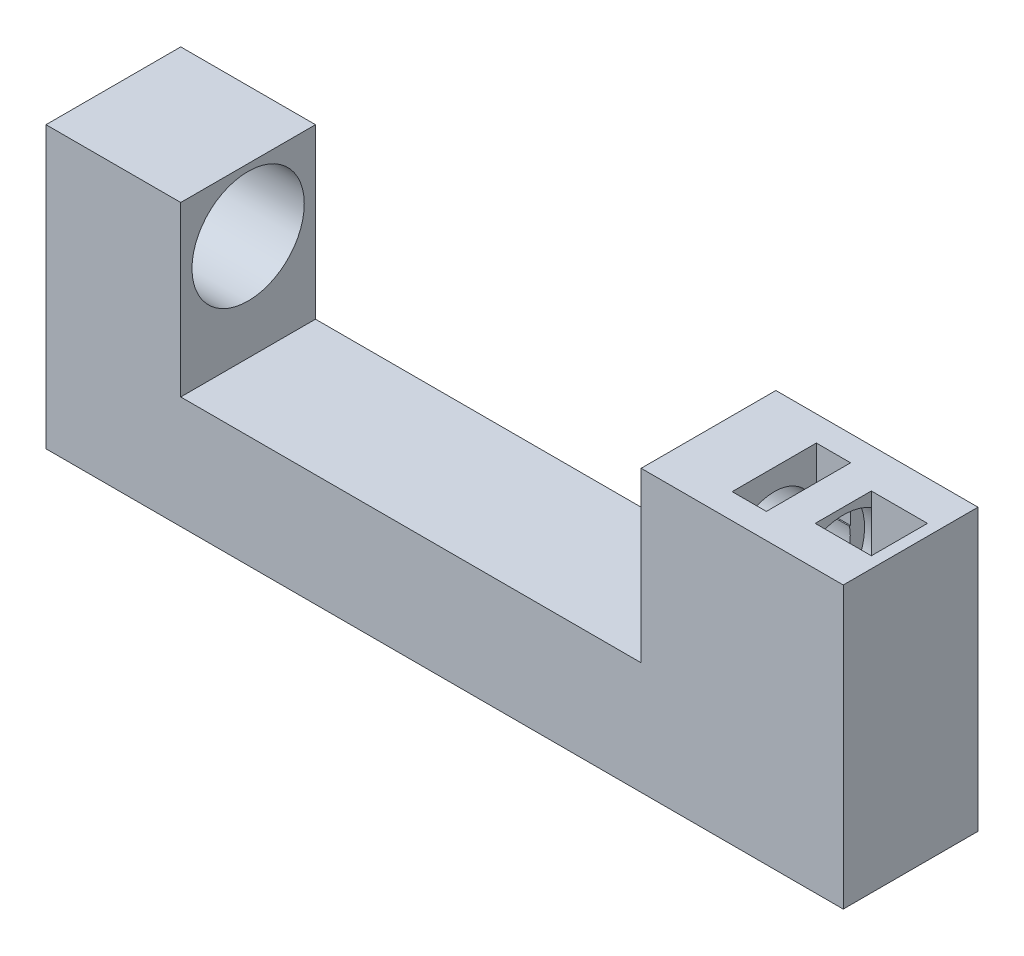
ISO-10303-21;
HEADER;
FILE_DESCRIPTION(('STEP AP214'),'2;1');
FILE_NAME('part.step','',(''),(''),'','','');
FILE_SCHEMA(('AUTOMOTIVE_DESIGN { 1 0 10303 214 1 1 1 1 }'));
ENDSEC;
DATA;
#1=APPLICATION_CONTEXT('core data for automotive mechanical design processes');
#2=APPLICATION_PROTOCOL_DEFINITION('international standard','automotive_design',2000,#1);
#3=PRODUCT_CONTEXT('',#1,'mechanical');
#4=PRODUCT('Part','Part','',(#3));
#5=PRODUCT_RELATED_PRODUCT_CATEGORY('part','',(#4));
#6=PRODUCT_DEFINITION_FORMATION('','',#4);
#7=PRODUCT_DEFINITION_CONTEXT('part definition',#1,'design');
#8=PRODUCT_DEFINITION('design','',#6,#7);
#9=PRODUCT_DEFINITION_SHAPE('','',#8);
#10=(LENGTH_UNIT() NAMED_UNIT(*) SI_UNIT(.MILLI.,.METRE.));
#11=(NAMED_UNIT(*) PLANE_ANGLE_UNIT() SI_UNIT($,.RADIAN.));
#12=(NAMED_UNIT(*) SI_UNIT($,.STERADIAN.) SOLID_ANGLE_UNIT());
#13=UNCERTAINTY_MEASURE_WITH_UNIT(LENGTH_MEASURE(1.E-05),#10,'distance_accuracy_value','');
#14=(GEOMETRIC_REPRESENTATION_CONTEXT(3) GLOBAL_UNCERTAINTY_ASSIGNED_CONTEXT((#13)) GLOBAL_UNIT_ASSIGNED_CONTEXT((#10,
#11,#12)) REPRESENTATION_CONTEXT('',''));
#15=CARTESIAN_POINT('',(0.,0.,0.));
#16=DIRECTION('',(0.,0.,1.));
#17=DIRECTION('',(1.,0.,0.));
#18=AXIS2_PLACEMENT_3D('',#15,#16,#17);
#19=CARTESIAN_POINT('',(32.5,25.,-6.));
#20=DIRECTION('',(-1.,0.,0.));
#21=DIRECTION('',(0.,0.,1.));
#22=AXIS2_PLACEMENT_3D('',#19,#20,#21);
#23=PLANE('',#22);
#24=DIRECTION('',(0.,0.,-1.));
#25=VECTOR('',#24,1.);
#26=CARTESIAN_POINT('',(32.5,25.,-6.));
#27=LINE('',#26,#25);
#28=CARTESIAN_POINT('',(32.5,25.,2.5));
#29=VERTEX_POINT('',#28);
#30=CARTESIAN_POINT('',(32.5,25.,-2.5));
#31=VERTEX_POINT('',#30);
#32=EDGE_CURVE('E359',#29,#31,#27,.T.);
#33=ORIENTED_EDGE('',*,*,#32,.F.);
#34=DIRECTION('',(0.,-1.,0.));
#35=VECTOR('',#34,1.);
#36=CARTESIAN_POINT('',(32.5,0.,2.5));
#37=LINE('',#36,#35);
#38=CARTESIAN_POINT('',(32.5,23.7293297065569,2.5));
#39=VERTEX_POINT('',#38);
#40=EDGE_CURVE('E224',#29,#39,#37,.T.);
#41=ORIENTED_EDGE('',*,*,#40,.T.);
#42=CARTESIAN_POINT('',(32.5,19.3992026876347,0.));
#43=DIRECTION('',(1.,0.,0.));
#44=DIRECTION('',(0.,0.,-1.));
#45=AXIS2_PLACEMENT_3D('',#42,#43,#44);
#46=CIRCLE('',#45,5.);
#47=CARTESIAN_POINT('',(32.5,23.7293297065569,-2.5));
#48=VERTEX_POINT('',#47);
#49=EDGE_CURVE('E354',#48,#39,#46,.T.);
#50=ORIENTED_EDGE('',*,*,#49,.F.);
#51=DIRECTION('',(0.,-1.,0.));
#52=VECTOR('',#51,1.);
#53=CARTESIAN_POINT('',(32.5,0.,-2.5));
#54=LINE('',#53,#52);
#55=EDGE_CURVE('E237',#31,#48,#54,.T.);
#56=ORIENTED_EDGE('',*,*,#55,.F.);
#57=EDGE_LOOP('',(#33,#41,#50,#56));
#58=FACE_BOUND('',#57,.T.);
#59=ADVANCED_FACE('F45',(#58),#23,.F.);
#60=CARTESIAN_POINT('',(6.35786437626904,19.3992026876347,0.));
#61=DIRECTION('',(1.,0.,0.));
#62=DIRECTION('',(0.,0.,-1.));
#63=AXIS2_PLACEMENT_3D('',#60,#61,#62);
#64=CYLINDRICAL_SURFACE('',#63,3.725);
#65=CARTESIAN_POINT('',(20.5,19.3992026876347,0.));
#66=DIRECTION('',(1.,0.,0.));
#67=DIRECTION('',(0.,0.,-1.));
#68=AXIS2_PLACEMENT_3D('',#65,#66,#67);
#69=CIRCLE('',#68,3.725);
#70=CARTESIAN_POINT('',(20.5,19.3992026876347,-3.725));
#71=VERTEX_POINT('',#70);
#72=EDGE_CURVE('E308',#71,#71,#69,.F.);
#73=ORIENTED_EDGE('',*,*,#72,.T.);
#74=EDGE_LOOP('',(#73));
#75=FACE_BOUND('',#74,.T.);
#76=DIRECTION('',(1.,0.,0.));
#77=VECTOR('',#76,1.);
#78=CARTESIAN_POINT('',(6.35786437626904,20.16,3.6464794596292));
#79=LINE('',#78,#77);
#80=CARTESIAN_POINT('',(29.4,20.16,3.64647945962921));
#81=VERTEX_POINT('',#80);
#82=CARTESIAN_POINT('',(26.3549967,20.16,3.64647945962921));
#83=VERTEX_POINT('',#82);
#84=EDGE_CURVE('E402',#81,#83,#79,.F.);
#85=ORIENTED_EDGE('',*,*,#84,.F.);
#86=CARTESIAN_POINT('',(29.4,19.3992026876347,0.));
#87=DIRECTION('',(1.,0.,0.));
#88=DIRECTION('',(0.,0.,-1.));
#89=AXIS2_PLACEMENT_3D('',#86,#87,#88);
#90=CIRCLE('',#89,3.725);
#91=CARTESIAN_POINT('',(29.4,20.16,-3.64647945962921));
#92=VERTEX_POINT('',#91);
#93=EDGE_CURVE('E300',#81,#92,#90,.T.);
#94=ORIENTED_EDGE('',*,*,#93,.T.);
#95=DIRECTION('',(1.,0.,0.));
#96=VECTOR('',#95,1.);
#97=CARTESIAN_POINT('',(6.35786437626905,20.16,-3.64647945962922));
#98=LINE('',#97,#96);
#99=CARTESIAN_POINT('',(26.3549967,20.16,-3.64647945962921));
#100=VERTEX_POINT('',#99);
#101=EDGE_CURVE('E392',#100,#92,#98,.T.);
#102=ORIENTED_EDGE('',*,*,#101,.F.);
#103=CARTESIAN_POINT('',(26.3549967,19.3992026876347,0.));
#104=DIRECTION('',(-1.,0.,0.));
#105=DIRECTION('',(0.,0.,1.));
#106=AXIS2_PLACEMENT_3D('',#103,#104,#105);
#107=CIRCLE('',#106,3.725);
#108=EDGE_CURVE('E398',#100,#83,#107,.F.);
#109=ORIENTED_EDGE('',*,*,#108,.T.);
#110=EDGE_LOOP('',(#85,#94,#102,#109));
#111=FACE_BOUND('',#110,.T.);
#112=ADVANCED_FACE('F450',(#75,#111),#64,.F.);
#113=CARTESIAN_POINT('',(0.,25.,0.));
#114=DIRECTION('',(0.,1.,0.));
#115=DIRECTION('',(0.,0.,1.));
#116=AXIS2_PLACEMENT_3D('',#113,#114,#115);
#117=PLANE('',#116);
#118=DIRECTION('',(0.,0.,1.));
#119=VECTOR('',#118,1.);
#120=CARTESIAN_POINT('',(-20.5,25.,-6.));
#121=LINE('',#120,#119);
#122=CARTESIAN_POINT('',(-20.5,25.,-6.));
#123=VERTEX_POINT('',#122);
#124=CARTESIAN_POINT('',(-20.5,25.,6.));
#125=VERTEX_POINT('',#124);
#126=EDGE_CURVE('E312',#123,#125,#121,.T.);
#127=ORIENTED_EDGE('',*,*,#126,.F.);
#128=DIRECTION('',(-1.,0.,0.));
#129=VECTOR('',#128,1.);
#130=CARTESIAN_POINT('',(-32.5,25.,-6.));
#131=LINE('',#130,#129);
#132=CARTESIAN_POINT('',(-32.5,25.,-6.));
#133=VERTEX_POINT('',#132);
#134=EDGE_CURVE('E363',#123,#133,#131,.T.);
#135=ORIENTED_EDGE('',*,*,#134,.T.);
#136=DIRECTION('',(0.,0.,1.));
#137=VECTOR('',#136,1.);
#138=CARTESIAN_POINT('',(-32.5,25.,-6.));
#139=LINE('',#138,#137);
#140=CARTESIAN_POINT('',(-32.5,25.,6.));
#141=VERTEX_POINT('',#140);
#142=EDGE_CURVE('E369',#133,#141,#139,.T.);
#143=ORIENTED_EDGE('',*,*,#142,.T.);
#144=DIRECTION('',(1.,0.,0.));
#145=VECTOR('',#144,1.);
#146=CARTESIAN_POINT('',(-32.5,25.,6.));
#147=LINE('',#146,#145);
#148=EDGE_CURVE('E373',#141,#125,#147,.T.);
#149=ORIENTED_EDGE('',*,*,#148,.T.);
#150=EDGE_LOOP('',(#127,#135,#143,#149));
#151=FACE_BOUND('',#150,.T.);
#152=ADVANCED_FACE('F452',(#151),#117,.T.);
#153=CARTESIAN_POINT('',(-32.5,19.3992026876347,0.));
#154=DIRECTION('',(1.,0.,0.));
#155=DIRECTION('',(0.,0.,-1.));
#156=AXIS2_PLACEMENT_3D('',#153,#154,#155);
#157=CYLINDRICAL_SURFACE('',#156,5.);
#158=CARTESIAN_POINT('',(-20.5,19.3992026876347,0.));
#159=DIRECTION('',(-1.,0.,0.));
#160=DIRECTION('',(0.,0.,1.));
#161=AXIS2_PLACEMENT_3D('',#158,#159,#160);
#162=CIRCLE('',#161,5.);
#163=CARTESIAN_POINT('',(-20.5,19.3992026876347,4.99999999999997));
#164=VERTEX_POINT('',#163);
#165=EDGE_CURVE('E338',#164,#164,#162,.F.);
#166=ORIENTED_EDGE('',*,*,#165,.T.);
#167=EDGE_LOOP('',(#166));
#168=FACE_BOUND('',#167,.T.);
#169=CARTESIAN_POINT('',(-32.5,19.3992026876347,0.));
#170=DIRECTION('',(1.,0.,0.));
#171=DIRECTION('',(0.,0.,-1.));
#172=AXIS2_PLACEMENT_3D('',#169,#170,#171);
#173=CIRCLE('',#172,5.);
#174=CARTESIAN_POINT('',(-32.5,19.3992026876347,-5.00000000000003));
#175=VERTEX_POINT('',#174);
#176=EDGE_CURVE('E349',#175,#175,#173,.T.);
#177=ORIENTED_EDGE('',*,*,#176,.F.);
#178=EDGE_LOOP('',(#177));
#179=FACE_BOUND('',#178,.T.);
#180=ADVANCED_FACE('F459',(#168,#179),#157,.F.);
#181=CARTESIAN_POINT('',(-32.5,25.,-6.));
#182=DIRECTION('',(0.,0.,1.));
#183=DIRECTION('',(1.,0.,0.));
#184=AXIS2_PLACEMENT_3D('',#181,#182,#183);
#185=PLANE('',#184);
#186=ORIENTED_EDGE('',*,*,#134,.F.);
#187=DIRECTION('',(0.,1.,0.));
#188=VECTOR('',#187,1.);
#189=CARTESIAN_POINT('',(-20.5,10.,-6.));
#190=LINE('',#189,#188);
#191=CARTESIAN_POINT('',(-20.5,10.,-6.));
#192=VERTEX_POINT('',#191);
#193=EDGE_CURVE('E335',#192,#123,#190,.T.);
#194=ORIENTED_EDGE('',*,*,#193,.F.);
#195=DIRECTION('',(-1.,0.,0.));
#196=VECTOR('',#195,1.);
#197=CARTESIAN_POINT('',(-20.5,10.,-6.));
#198=LINE('',#197,#196);
#199=CARTESIAN_POINT('',(20.5,10.,-6.));
#200=VERTEX_POINT('',#199);
#201=EDGE_CURVE('E326',#200,#192,#198,.T.);
#202=ORIENTED_EDGE('',*,*,#201,.F.);
#203=DIRECTION('',(0.,1.,0.));
#204=VECTOR('',#203,1.);
#205=CARTESIAN_POINT('',(20.5,10.,-6.));
#206=LINE('',#205,#204);
#207=CARTESIAN_POINT('',(20.5,25.,-6.));
#208=VERTEX_POINT('',#207);
#209=EDGE_CURVE('E339',#200,#208,#206,.T.);
#210=ORIENTED_EDGE('',*,*,#209,.T.);
#211=CARTESIAN_POINT('',(38.5,25.,-6.));
#212=VERTEX_POINT('',#211);
#213=EDGE_CURVE('E365',#212,#208,#131,.T.);
#214=ORIENTED_EDGE('',*,*,#213,.F.);
#215=DIRECTION('',(0.,1.,0.));
#216=VECTOR('',#215,1.);
#217=CARTESIAN_POINT('',(38.5,0.,-6.));
#218=LINE('',#217,#216);
#219=CARTESIAN_POINT('',(38.5,0.,-6.));
#220=VERTEX_POINT('',#219);
#221=EDGE_CURVE('E232',#220,#212,#218,.T.);
#222=ORIENTED_EDGE('',*,*,#221,.F.);
#223=DIRECTION('',(-1.,0.,0.));
#224=VECTOR('',#223,1.);
#225=CARTESIAN_POINT('',(-32.5,0.,-6.));
#226=LINE('',#225,#224);
#227=CARTESIAN_POINT('',(-32.5,0.,-6.));
#228=VERTEX_POINT('',#227);
#229=EDGE_CURVE('E353',#220,#228,#226,.T.);
#230=ORIENTED_EDGE('',*,*,#229,.T.);
#231=DIRECTION('',(0.,-1.,0.));
#232=VECTOR('',#231,1.);
#233=CARTESIAN_POINT('',(-32.5,25.,-6.));
#234=LINE('',#233,#232);
#235=EDGE_CURVE('E388',#133,#228,#234,.T.);
#236=ORIENTED_EDGE('',*,*,#235,.F.);
#237=EDGE_LOOP('',(#186,#194,#202,#210,#214,#222,#230,#236));
#238=FACE_BOUND('',#237,.T.);
#239=ADVANCED_FACE('F494',(#238),#185,.F.);
#240=CARTESIAN_POINT('',(-32.5,25.,-6.));
#241=DIRECTION('',(1.,0.,0.));
#242=DIRECTION('',(0.,0.,-1.));
#243=AXIS2_PLACEMENT_3D('',#240,#241,#242);
#244=PLANE('',#243);
#245=ORIENTED_EDGE('',*,*,#176,.T.);
#246=EDGE_LOOP('',(#245));
#247=FACE_BOUND('',#246,.T.);
#248=DIRECTION('',(0.,0.,1.));
#249=VECTOR('',#248,1.);
#250=CARTESIAN_POINT('',(-32.5,0.,-6.));
#251=LINE('',#250,#249);
#252=CARTESIAN_POINT('',(-32.5,0.,6.));
#253=VERTEX_POINT('',#252);
#254=EDGE_CURVE('E380',#228,#253,#251,.T.);
#255=ORIENTED_EDGE('',*,*,#254,.T.);
#256=DIRECTION('',(0.,-1.,0.));
#257=VECTOR('',#256,1.);
#258=CARTESIAN_POINT('',(-32.5,25.,6.));
#259=LINE('',#258,#257);
#260=EDGE_CURVE('E377',#141,#253,#259,.T.);
#261=ORIENTED_EDGE('',*,*,#260,.F.);
#262=ORIENTED_EDGE('',*,*,#142,.F.);
#263=ORIENTED_EDGE('',*,*,#235,.T.);
#264=EDGE_LOOP('',(#255,#261,#262,#263));
#265=FACE_BOUND('',#264,.T.);
#266=ADVANCED_FACE('F491',(#247,#265),#244,.F.);
#267=CARTESIAN_POINT('',(-32.5,25.,6.));
#268=DIRECTION('',(0.,0.,-1.));
#269=DIRECTION('',(-1.,0.,0.));
#270=AXIS2_PLACEMENT_3D('',#267,#268,#269);
#271=PLANE('',#270);
#272=DIRECTION('',(1.,0.,0.));
#273=VECTOR('',#272,1.);
#274=CARTESIAN_POINT('',(-20.5,10.,6.));
#275=LINE('',#274,#273);
#276=CARTESIAN_POINT('',(-20.5,10.,6.));
#277=VERTEX_POINT('',#276);
#278=CARTESIAN_POINT('',(20.5,10.,6.));
#279=VERTEX_POINT('',#278);
#280=EDGE_CURVE('E317',#277,#279,#275,.T.);
#281=ORIENTED_EDGE('',*,*,#280,.F.);
#282=DIRECTION('',(0.,1.,0.));
#283=VECTOR('',#282,1.);
#284=CARTESIAN_POINT('',(-20.5,10.,6.));
#285=LINE('',#284,#283);
#286=EDGE_CURVE('E330',#277,#125,#285,.T.);
#287=ORIENTED_EDGE('',*,*,#286,.T.);
#288=ORIENTED_EDGE('',*,*,#148,.F.);
#289=ORIENTED_EDGE('',*,*,#260,.T.);
#290=DIRECTION('',(1.,0.,0.));
#291=VECTOR('',#290,1.);
#292=CARTESIAN_POINT('',(-32.5,0.,6.));
#293=LINE('',#292,#291);
#294=CARTESIAN_POINT('',(38.5,0.,6.));
#295=VERTEX_POINT('',#294);
#296=EDGE_CURVE('E364',#253,#295,#293,.T.);
#297=ORIENTED_EDGE('',*,*,#296,.T.);
#298=DIRECTION('',(0.,-1.,0.));
#299=VECTOR('',#298,1.);
#300=CARTESIAN_POINT('',(38.5,0.,6.));
#301=LINE('',#300,#299);
#302=CARTESIAN_POINT('',(38.5,25.,6.));
#303=VERTEX_POINT('',#302);
#304=EDGE_CURVE('E223',#303,#295,#301,.T.);
#305=ORIENTED_EDGE('',*,*,#304,.F.);
#306=CARTESIAN_POINT('',(20.5,25.,6.));
#307=VERTEX_POINT('',#306);
#308=EDGE_CURVE('E372',#307,#303,#147,.T.);
#309=ORIENTED_EDGE('',*,*,#308,.F.);
#310=DIRECTION('',(0.,1.,0.));
#311=VECTOR('',#310,1.);
#312=CARTESIAN_POINT('',(20.5,10.,6.));
#313=LINE('',#312,#311);
#314=EDGE_CURVE('E343',#279,#307,#313,.T.);
#315=ORIENTED_EDGE('',*,*,#314,.F.);
#316=EDGE_LOOP('',(#281,#287,#288,#289,#297,#305,#309,#315));
#317=FACE_BOUND('',#316,.T.);
#318=ADVANCED_FACE('F484',(#317),#271,.F.);
#319=DIRECTION('',(-1.,0.,0.));
#320=VECTOR('',#319,1.);
#321=CARTESIAN_POINT('',(38.5,25.,-2.5));
#322=LINE('',#321,#320);
#323=CARTESIAN_POINT('',(37.5,25.,-2.5));
#324=VERTEX_POINT('',#323);
#325=EDGE_CURVE('E245',#324,#31,#322,.T.);
#326=ORIENTED_EDGE('',*,*,#325,.F.);
#327=DIRECTION('',(0.,0.,1.));
#328=VECTOR('',#327,1.);
#329=CARTESIAN_POINT('',(37.5,25.,-2.5));
#330=LINE('',#329,#328);
#331=CARTESIAN_POINT('',(37.5,25.,2.5));
#332=VERTEX_POINT('',#331);
#333=EDGE_CURVE('E196',#324,#332,#330,.T.);
#334=ORIENTED_EDGE('',*,*,#333,.T.);
#335=DIRECTION('',(-1.,0.,0.));
#336=VECTOR('',#335,1.);
#337=CARTESIAN_POINT('',(38.5,25.,2.5));
#338=LINE('',#337,#336);
#339=EDGE_CURVE('E236',#332,#29,#338,.T.);
#340=ORIENTED_EDGE('',*,*,#339,.T.);
#341=ORIENTED_EDGE('',*,*,#32,.T.);
#342=EDGE_LOOP('',(#326,#334,#340,#341));
#343=FACE_BOUND('',#342,.T.);
#344=DIRECTION('',(0.,0.,1.));
#345=VECTOR('',#344,1.);
#346=CARTESIAN_POINT('',(26.3549967,25.,3.75));
#347=LINE('',#346,#345);
#348=CARTESIAN_POINT('',(26.3549967,25.,-3.75));
#349=VERTEX_POINT('',#348);
#350=CARTESIAN_POINT('',(26.3549967,25.,3.75));
#351=VERTEX_POINT('',#350);
#352=EDGE_CURVE('E248',#349,#351,#347,.T.);
#353=ORIENTED_EDGE('',*,*,#352,.F.);
#354=DIRECTION('',(-1.,0.,0.));
#355=VECTOR('',#354,1.);
#356=CARTESIAN_POINT('',(29.4050033,25.,-3.75));
#357=LINE('',#356,#355);
#358=CARTESIAN_POINT('',(29.4050033,25.,-3.75));
#359=VERTEX_POINT('',#358);
#360=EDGE_CURVE('E271',#359,#349,#357,.T.);
#361=ORIENTED_EDGE('',*,*,#360,.F.);
#362=DIRECTION('',(0.,0.,-1.));
#363=VECTOR('',#362,1.);
#364=CARTESIAN_POINT('',(29.4050033,25.,3.75));
#365=LINE('',#364,#363);
#366=CARTESIAN_POINT('',(29.4050033,25.,3.75));
#367=VERTEX_POINT('',#366);
#368=EDGE_CURVE('E267',#367,#359,#365,.T.);
#369=ORIENTED_EDGE('',*,*,#368,.F.);
#370=DIRECTION('',(1.,0.,0.));
#371=VECTOR('',#370,1.);
#372=CARTESIAN_POINT('',(29.4050033,25.,3.75));
#373=LINE('',#372,#371);
#374=EDGE_CURVE('E263',#351,#367,#373,.T.);
#375=ORIENTED_EDGE('',*,*,#374,.F.);
#376=EDGE_LOOP('',(#353,#361,#369,#375));
#377=FACE_BOUND('',#376,.T.);
#378=DIRECTION('',(0.,0.,-1.));
#379=VECTOR('',#378,1.);
#380=CARTESIAN_POINT('',(20.5,25.,-6.));
#381=LINE('',#380,#379);
#382=EDGE_CURVE('E318',#307,#208,#381,.T.);
#383=ORIENTED_EDGE('',*,*,#382,.F.);
#384=ORIENTED_EDGE('',*,*,#308,.T.);
#385=DIRECTION('',(0.,0.,1.));
#386=VECTOR('',#385,1.);
#387=CARTESIAN_POINT('',(38.5,25.,0.));
#388=LINE('',#387,#386);
#389=EDGE_CURVE('E220',#212,#303,#388,.T.);
#390=ORIENTED_EDGE('',*,*,#389,.F.);
#391=ORIENTED_EDGE('',*,*,#213,.T.);
#392=EDGE_LOOP('',(#383,#384,#390,#391));
#393=FACE_BOUND('',#392,.T.);
#394=ADVANCED_FACE('F441',(#343,#377,#393),#117,.T.);
#395=CARTESIAN_POINT('',(0.,0.,0.));
#396=DIRECTION('',(0.,1.,0.));
#397=DIRECTION('',(0.,0.,1.));
#398=AXIS2_PLACEMENT_3D('',#395,#396,#397);
#399=PLANE('',#398);
#400=ORIENTED_EDGE('',*,*,#229,.F.);
#401=DIRECTION('',(0.,0.,-1.));
#402=VECTOR('',#401,1.);
#403=CARTESIAN_POINT('',(38.5,0.,0.));
#404=LINE('',#403,#402);
#405=EDGE_CURVE('E228',#295,#220,#404,.T.);
#406=ORIENTED_EDGE('',*,*,#405,.F.);
#407=ORIENTED_EDGE('',*,*,#296,.F.);
#408=ORIENTED_EDGE('',*,*,#254,.F.);
#409=EDGE_LOOP('',(#400,#406,#407,#408));
#410=FACE_BOUND('',#409,.T.);
#411=ADVANCED_FACE('F481',(#410),#399,.F.);
#412=CARTESIAN_POINT('',(29.4050033,19.3992026876347,0.));
#413=DIRECTION('',(1.,0.,0.));
#414=DIRECTION('',(0.,0.,-1.));
#415=AXIS2_PLACEMENT_3D('',#412,#413,#414);
#416=CIRCLE('',#415,5.);
#417=CARTESIAN_POINT('',(29.4050033,22.7063918264654,3.75));
#418=VERTEX_POINT('',#417);
#419=CARTESIAN_POINT('',(29.4050033,22.7063918264655,-3.74999999999999));
#420=VERTEX_POINT('',#419);
#421=EDGE_CURVE('E11',#418,#420,#416,.F.);
#422=ORIENTED_EDGE('',*,*,#421,.T.);
#423=DIRECTION('',(1.,0.,0.));
#424=VECTOR('',#423,1.);
#425=CARTESIAN_POINT('',(-32.5,22.7063918264655,-3.74999999999999));
#426=LINE('',#425,#424);
#427=CARTESIAN_POINT('',(29.4,22.7063918264655,-3.75));
#428=VERTEX_POINT('',#427);
#429=EDGE_CURVE('E296',#420,#428,#426,.F.);
#430=ORIENTED_EDGE('',*,*,#429,.T.);
#431=CARTESIAN_POINT('',(29.4,19.3992026876347,0.));
#432=DIRECTION('',(1.,0.,0.));
#433=DIRECTION('',(0.,0.,-1.));
#434=AXIS2_PLACEMENT_3D('',#431,#432,#433);
#435=CIRCLE('',#434,5.);
#436=CARTESIAN_POINT('',(29.4,22.7063918264655,3.75));
#437=VERTEX_POINT('',#436);
#438=EDGE_CURVE('E304',#437,#428,#435,.T.);
#439=ORIENTED_EDGE('',*,*,#438,.F.);
#440=DIRECTION('',(1.,0.,0.));
#441=VECTOR('',#440,1.);
#442=CARTESIAN_POINT('',(-32.5,22.7063918264654,3.75));
#443=LINE('',#442,#441);
#444=EDGE_CURVE('E292',#437,#418,#443,.T.);
#445=ORIENTED_EDGE('',*,*,#444,.T.);
#446=EDGE_LOOP('',(#422,#430,#439,#445));
#447=FACE_BOUND('',#446,.T.);
#448=ORIENTED_EDGE('',*,*,#49,.T.);
#449=EDGE_CURVE('E358',#39,#48,#46,.T.);
#450=ORIENTED_EDGE('',*,*,#449,.T.);
#451=EDGE_LOOP('',(#448,#450));
#452=FACE_BOUND('',#451,.T.);
#453=ADVANCED_FACE('F417',(#447,#452),#157,.F.);
#454=CARTESIAN_POINT('',(-20.5,10.,-6.));
#455=DIRECTION('',(-1.,0.,0.));
#456=DIRECTION('',(0.,0.,1.));
#457=AXIS2_PLACEMENT_3D('',#454,#455,#456);
#458=PLANE('',#457);
#459=ORIENTED_EDGE('',*,*,#126,.T.);
#460=ORIENTED_EDGE('',*,*,#286,.F.);
#461=DIRECTION('',(0.,0.,1.));
#462=VECTOR('',#461,1.);
#463=CARTESIAN_POINT('',(-20.5,10.,-6.));
#464=LINE('',#463,#462);
#465=EDGE_CURVE('E313',#192,#277,#464,.T.);
#466=ORIENTED_EDGE('',*,*,#465,.F.);
#467=ORIENTED_EDGE('',*,*,#193,.T.);
#468=EDGE_LOOP('',(#459,#460,#466,#467));
#469=FACE_BOUND('',#468,.T.);
#470=ORIENTED_EDGE('',*,*,#165,.F.);
#471=EDGE_LOOP('',(#470));
#472=FACE_BOUND('',#471,.T.);
#473=ADVANCED_FACE('F475',(#469,#472),#458,.F.);
#474=CARTESIAN_POINT('',(20.5,10.,-6.));
#475=DIRECTION('',(1.,0.,0.));
#476=DIRECTION('',(0.,0.,-1.));
#477=AXIS2_PLACEMENT_3D('',#474,#475,#476);
#478=PLANE('',#477);
#479=ORIENTED_EDGE('',*,*,#382,.T.);
#480=ORIENTED_EDGE('',*,*,#209,.F.);
#481=DIRECTION('',(0.,0.,-1.));
#482=VECTOR('',#481,1.);
#483=CARTESIAN_POINT('',(20.5,10.,-6.));
#484=LINE('',#483,#482);
#485=EDGE_CURVE('E322',#279,#200,#484,.T.);
#486=ORIENTED_EDGE('',*,*,#485,.F.);
#487=ORIENTED_EDGE('',*,*,#314,.T.);
#488=EDGE_LOOP('',(#479,#480,#486,#487));
#489=FACE_BOUND('',#488,.T.);
#490=ORIENTED_EDGE('',*,*,#72,.F.);
#491=EDGE_LOOP('',(#490));
#492=FACE_BOUND('',#491,.T.);
#493=ADVANCED_FACE('F471',(#489,#492),#478,.F.);
#494=CARTESIAN_POINT('',(0.,10.,0.));
#495=DIRECTION('',(0.,1.,0.));
#496=DIRECTION('',(0.,0.,1.));
#497=AXIS2_PLACEMENT_3D('',#494,#495,#496);
#498=PLANE('',#497);
#499=ORIENTED_EDGE('',*,*,#465,.T.);
#500=ORIENTED_EDGE('',*,*,#280,.T.);
#501=ORIENTED_EDGE('',*,*,#485,.T.);
#502=ORIENTED_EDGE('',*,*,#201,.T.);
#503=EDGE_LOOP('',(#499,#500,#501,#502));
#504=FACE_BOUND('',#503,.T.);
#505=ADVANCED_FACE('F468',(#504),#498,.T.);
#506=CARTESIAN_POINT('',(29.4,19.3992026876347,0.));
#507=DIRECTION('',(1.,0.,0.));
#508=DIRECTION('',(0.,0.,-1.));
#509=AXIS2_PLACEMENT_3D('',#506,#507,#508);
#510=PLANE('',#509);
#511=DIRECTION('',(0.,1.,0.));
#512=VECTOR('',#511,1.);
#513=CARTESIAN_POINT('',(29.4,19.3992026876347,-3.75));
#514=LINE('',#513,#512);
#515=CARTESIAN_POINT('',(29.4,20.16,-3.75));
#516=VERTEX_POINT('',#515);
#517=EDGE_CURVE('E53',#516,#428,#514,.T.);
#518=ORIENTED_EDGE('',*,*,#517,.F.);
#519=DIRECTION('',(0.,0.,1.));
#520=VECTOR('',#519,1.);
#521=CARTESIAN_POINT('',(29.4,20.16,0.));
#522=LINE('',#521,#520);
#523=EDGE_CURVE('E278',#516,#92,#522,.T.);
#524=ORIENTED_EDGE('',*,*,#523,.T.);
#525=ORIENTED_EDGE('',*,*,#93,.F.);
#526=CARTESIAN_POINT('',(29.4,20.16,3.75));
#527=VERTEX_POINT('',#526);
#528=EDGE_CURVE('E291',#81,#527,#522,.T.);
#529=ORIENTED_EDGE('',*,*,#528,.T.);
#530=DIRECTION('',(0.,-1.,0.));
#531=VECTOR('',#530,1.);
#532=CARTESIAN_POINT('',(29.4,19.3992026876347,3.75));
#533=LINE('',#532,#531);
#534=EDGE_CURVE('E405',#437,#527,#533,.T.);
#535=ORIENTED_EDGE('',*,*,#534,.F.);
#536=ORIENTED_EDGE('',*,*,#438,.T.);
#537=EDGE_LOOP('',(#518,#524,#525,#529,#535,#536));
#538=FACE_BOUND('',#537,.T.);
#539=ADVANCED_FACE('F420',(#538),#510,.T.);
#540=CARTESIAN_POINT('',(29.4050033,20.16,3.75));
#541=DIRECTION('',(1.,0.,0.));
#542=DIRECTION('',(0.,0.,-1.));
#543=AXIS2_PLACEMENT_3D('',#540,#541,#542);
#544=PLANE('',#543);
#545=DIRECTION('',(0.,1.,0.));
#546=VECTOR('',#545,1.);
#547=CARTESIAN_POINT('',(29.4050033,20.16,3.75));
#548=LINE('',#547,#546);
#549=EDGE_CURVE('E282',#418,#367,#548,.T.);
#550=ORIENTED_EDGE('',*,*,#549,.T.);
#551=ORIENTED_EDGE('',*,*,#368,.T.);
#552=DIRECTION('',(0.,1.,0.));
#553=VECTOR('',#552,1.);
#554=CARTESIAN_POINT('',(29.4050033,20.16,-3.75));
#555=LINE('',#554,#553);
#556=EDGE_CURVE('E279',#420,#359,#555,.T.);
#557=ORIENTED_EDGE('',*,*,#556,.F.);
#558=ORIENTED_EDGE('',*,*,#421,.F.);
#559=EDGE_LOOP('',(#550,#551,#557,#558));
#560=FACE_BOUND('',#559,.T.);
#561=ADVANCED_FACE('F445',(#560),#544,.F.);
#562=CARTESIAN_POINT('',(29.4050033,20.16,-3.75));
#563=DIRECTION('',(0.,0.,-1.));
#564=DIRECTION('',(-1.,0.,0.));
#565=AXIS2_PLACEMENT_3D('',#562,#563,#564);
#566=PLANE('',#565);
#567=ORIENTED_EDGE('',*,*,#556,.T.);
#568=ORIENTED_EDGE('',*,*,#360,.T.);
#569=DIRECTION('',(0.,1.,0.));
#570=VECTOR('',#569,1.);
#571=CARTESIAN_POINT('',(26.3549967,20.16,-3.75));
#572=LINE('',#571,#570);
#573=CARTESIAN_POINT('',(26.3549967,20.16,-3.75));
#574=VERTEX_POINT('',#573);
#575=EDGE_CURVE('E275',#574,#349,#572,.T.);
#576=ORIENTED_EDGE('',*,*,#575,.F.);
#577=DIRECTION('',(-1.,0.,0.));
#578=VECTOR('',#577,1.);
#579=CARTESIAN_POINT('',(29.4050033,20.16,-3.75));
#580=LINE('',#579,#578);
#581=EDGE_CURVE('E257',#516,#574,#580,.T.);
#582=ORIENTED_EDGE('',*,*,#581,.F.);
#583=ORIENTED_EDGE('',*,*,#517,.T.);
#584=ORIENTED_EDGE('',*,*,#429,.F.);
#585=EDGE_LOOP('',(#567,#568,#576,#582,#583,#584));
#586=FACE_BOUND('',#585,.T.);
#587=ADVANCED_FACE('F411',(#586),#566,.F.);
#588=CARTESIAN_POINT('',(29.4050033,20.16,3.75));
#589=DIRECTION('',(0.,0.,1.));
#590=DIRECTION('',(1.,0.,0.));
#591=AXIS2_PLACEMENT_3D('',#588,#589,#590);
#592=PLANE('',#591);
#593=ORIENTED_EDGE('',*,*,#534,.T.);
#594=DIRECTION('',(1.,0.,0.));
#595=VECTOR('',#594,1.);
#596=CARTESIAN_POINT('',(29.4050033,20.16,3.75));
#597=LINE('',#596,#595);
#598=CARTESIAN_POINT('',(26.3549967,20.16,3.75));
#599=VERTEX_POINT('',#598);
#600=EDGE_CURVE('E252',#599,#527,#597,.T.);
#601=ORIENTED_EDGE('',*,*,#600,.F.);
#602=DIRECTION('',(0.,1.,0.));
#603=VECTOR('',#602,1.);
#604=CARTESIAN_POINT('',(26.3549967,20.16,3.75));
#605=LINE('',#604,#603);
#606=EDGE_CURVE('E260',#599,#351,#605,.T.);
#607=ORIENTED_EDGE('',*,*,#606,.T.);
#608=ORIENTED_EDGE('',*,*,#374,.T.);
#609=ORIENTED_EDGE('',*,*,#549,.F.);
#610=ORIENTED_EDGE('',*,*,#444,.F.);
#611=EDGE_LOOP('',(#593,#601,#607,#608,#609,#610));
#612=FACE_BOUND('',#611,.T.);
#613=ADVANCED_FACE('F425',(#612),#592,.F.);
#614=CARTESIAN_POINT('',(26.3549967,20.16,3.75));
#615=DIRECTION('',(-1.,0.,0.));
#616=DIRECTION('',(0.,0.,1.));
#617=AXIS2_PLACEMENT_3D('',#614,#615,#616);
#618=PLANE('',#617);
#619=DIRECTION('',(0.,0.,1.));
#620=VECTOR('',#619,1.);
#621=CARTESIAN_POINT('',(26.3549967,20.16,3.75));
#622=LINE('',#621,#620);
#623=EDGE_CURVE('E249',#574,#100,#622,.T.);
#624=ORIENTED_EDGE('',*,*,#623,.F.);
#625=ORIENTED_EDGE('',*,*,#575,.T.);
#626=ORIENTED_EDGE('',*,*,#352,.T.);
#627=ORIENTED_EDGE('',*,*,#606,.F.);
#628=EDGE_CURVE('E253',#83,#599,#622,.T.);
#629=ORIENTED_EDGE('',*,*,#628,.F.);
#630=ORIENTED_EDGE('',*,*,#108,.F.);
#631=EDGE_LOOP('',(#624,#625,#626,#627,#629,#630));
#632=FACE_BOUND('',#631,.T.);
#633=ADVANCED_FACE('F436',(#632),#618,.F.);
#634=CARTESIAN_POINT('',(0.,20.16,0.));
#635=DIRECTION('',(0.,1.,0.));
#636=DIRECTION('',(0.,0.,1.));
#637=AXIS2_PLACEMENT_3D('',#634,#635,#636);
#638=PLANE('',#637);
#639=ORIENTED_EDGE('',*,*,#84,.T.);
#640=ORIENTED_EDGE('',*,*,#628,.T.);
#641=ORIENTED_EDGE('',*,*,#600,.T.);
#642=ORIENTED_EDGE('',*,*,#528,.F.);
#643=EDGE_LOOP('',(#639,#640,#641,#642));
#644=FACE_BOUND('',#643,.T.);
#645=ADVANCED_FACE('F428',(#644),#638,.T.);
#646=ORIENTED_EDGE('',*,*,#581,.T.);
#647=ORIENTED_EDGE('',*,*,#623,.T.);
#648=ORIENTED_EDGE('',*,*,#101,.T.);
#649=ORIENTED_EDGE('',*,*,#523,.F.);
#650=EDGE_LOOP('',(#646,#647,#648,#649));
#651=FACE_BOUND('',#650,.T.);
#652=ADVANCED_FACE('F448',(#651),#638,.T.);
#653=CARTESIAN_POINT('',(32.5,0.,0.));
#654=DIRECTION('',(1.,0.,0.));
#655=DIRECTION('',(0.,0.,-1.));
#656=AXIS2_PLACEMENT_3D('',#653,#654,#655);
#657=PLANE('',#656);
#658=ORIENTED_EDGE('',*,*,#449,.F.);
#659=CARTESIAN_POINT('',(32.5,18.3854893389424,2.5));
#660=VERTEX_POINT('',#659);
#661=EDGE_CURVE('E240',#39,#660,#37,.T.);
#662=ORIENTED_EDGE('',*,*,#661,.T.);
#663=DIRECTION('',(0.,0.,1.));
#664=VECTOR('',#663,1.);
#665=CARTESIAN_POINT('',(32.5,18.3854893389424,-2.5));
#666=LINE('',#665,#664);
#667=CARTESIAN_POINT('',(32.5,18.3854893389424,-2.5));
#668=VERTEX_POINT('',#667);
#669=EDGE_CURVE('E212',#668,#660,#666,.T.);
#670=ORIENTED_EDGE('',*,*,#669,.F.);
#671=EDGE_CURVE('E68',#48,#668,#54,.T.);
#672=ORIENTED_EDGE('',*,*,#671,.F.);
#673=EDGE_LOOP('',(#658,#662,#670,#672));
#674=FACE_BOUND('',#673,.T.);
#675=ADVANCED_FACE('F515',(#674),#657,.F.);
#676=CARTESIAN_POINT('',(38.5,0.,-2.5));
#677=DIRECTION('',(0.,0.,-1.));
#678=DIRECTION('',(-1.,0.,0.));
#679=AXIS2_PLACEMENT_3D('',#676,#677,#678);
#680=PLANE('',#679);
#681=ORIENTED_EDGE('',*,*,#671,.T.);
#682=DIRECTION('',(-1.,0.,0.));
#683=VECTOR('',#682,1.);
#684=CARTESIAN_POINT('',(32.5,18.3854893389424,-2.5));
#685=LINE('',#684,#683);
#686=CARTESIAN_POINT('',(37.5,18.3854893389424,-2.5));
#687=VERTEX_POINT('',#686);
#688=EDGE_CURVE('E201',#687,#668,#685,.T.);
#689=ORIENTED_EDGE('',*,*,#688,.F.);
#690=DIRECTION('',(0.,1.,0.));
#691=VECTOR('',#690,1.);
#692=CARTESIAN_POINT('',(37.5,8.79446988734959,-2.5));
#693=LINE('',#692,#691);
#694=EDGE_CURVE('E191',#687,#324,#693,.T.);
#695=ORIENTED_EDGE('',*,*,#694,.T.);
#696=ORIENTED_EDGE('',*,*,#325,.T.);
#697=ORIENTED_EDGE('',*,*,#55,.T.);
#698=EDGE_LOOP('',(#681,#689,#695,#696,#697));
#699=FACE_BOUND('',#698,.T.);
#700=ADVANCED_FACE('F202',(#699),#680,.F.);
#701=CARTESIAN_POINT('',(38.5,0.,2.5));
#702=DIRECTION('',(0.,0.,-1.));
#703=DIRECTION('',(-1.,0.,0.));
#704=AXIS2_PLACEMENT_3D('',#701,#702,#703);
#705=PLANE('',#704);
#706=DIRECTION('',(1.,0.,0.));
#707=VECTOR('',#706,1.);
#708=CARTESIAN_POINT('',(32.5,18.3854893389424,2.5));
#709=LINE('',#708,#707);
#710=CARTESIAN_POINT('',(37.5,18.3854893389424,2.5));
#711=VERTEX_POINT('',#710);
#712=EDGE_CURVE('E60',#660,#711,#709,.T.);
#713=ORIENTED_EDGE('',*,*,#712,.F.);
#714=ORIENTED_EDGE('',*,*,#661,.F.);
#715=ORIENTED_EDGE('',*,*,#40,.F.);
#716=ORIENTED_EDGE('',*,*,#339,.F.);
#717=DIRECTION('',(0.,1.,0.));
#718=VECTOR('',#717,1.);
#719=CARTESIAN_POINT('',(37.5,8.79446988734959,2.5));
#720=LINE('',#719,#718);
#721=EDGE_CURVE('E199',#711,#332,#720,.T.);
#722=ORIENTED_EDGE('',*,*,#721,.F.);
#723=EDGE_LOOP('',(#713,#714,#715,#716,#722));
#724=FACE_BOUND('',#723,.T.);
#725=ADVANCED_FACE('F518',(#724),#705,.T.);
#726=CARTESIAN_POINT('',(38.5,0.,0.));
#727=DIRECTION('',(1.,0.,0.));
#728=DIRECTION('',(0.,0.,-1.));
#729=AXIS2_PLACEMENT_3D('',#726,#727,#728);
#730=PLANE('',#729);
#731=ORIENTED_EDGE('',*,*,#389,.T.);
#732=ORIENTED_EDGE('',*,*,#304,.T.);
#733=ORIENTED_EDGE('',*,*,#405,.T.);
#734=ORIENTED_EDGE('',*,*,#221,.T.);
#735=EDGE_LOOP('',(#731,#732,#733,#734));
#736=FACE_BOUND('',#735,.T.);
#737=ADVANCED_FACE('F524',(#736),#730,.T.);
#738=CARTESIAN_POINT('',(37.5,8.79446988734959,-2.5));
#739=DIRECTION('',(-1.,0.,0.));
#740=DIRECTION('',(0.,0.,1.));
#741=AXIS2_PLACEMENT_3D('',#738,#739,#740);
#742=PLANE('',#741);
#743=DIRECTION('',(0.,0.,-1.));
#744=VECTOR('',#743,1.);
#745=CARTESIAN_POINT('',(37.5,18.3854893389424,-2.5));
#746=LINE('',#745,#744);
#747=EDGE_CURVE('E194',#711,#687,#746,.T.);
#748=ORIENTED_EDGE('',*,*,#747,.F.);
#749=ORIENTED_EDGE('',*,*,#721,.T.);
#750=ORIENTED_EDGE('',*,*,#333,.F.);
#751=ORIENTED_EDGE('',*,*,#694,.F.);
#752=EDGE_LOOP('',(#748,#749,#750,#751));
#753=FACE_BOUND('',#752,.T.);
#754=ADVANCED_FACE('F192',(#753),#742,.T.);
#755=CARTESIAN_POINT('',(0.,18.3854893389424,0.));
#756=DIRECTION('',(0.,1.,0.));
#757=DIRECTION('',(0.,0.,1.));
#758=AXIS2_PLACEMENT_3D('',#755,#756,#757);
#759=PLANE('',#758);
#760=ORIENTED_EDGE('',*,*,#669,.T.);
#761=ORIENTED_EDGE('',*,*,#712,.T.);
#762=ORIENTED_EDGE('',*,*,#747,.T.);
#763=ORIENTED_EDGE('',*,*,#688,.T.);
#764=EDGE_LOOP('',(#760,#761,#762,#763));
#765=FACE_BOUND('',#764,.T.);
#766=ADVANCED_FACE('F208',(#765),#759,.T.);
#767=CLOSED_SHELL('',(#59,#112,#152,#180,#239,#266,#318,#394,#411,#453,#473,#493,#505,#539,#561,
#587,#613,#633,#645,#652,#675,#700,#725,#737,#754,#766));
#768=MANIFOLD_SOLID_BREP('B2',#767);
#769=ADVANCED_BREP_SHAPE_REPRESENTATION('',(#18,#768),#14);
#770=SHAPE_DEFINITION_REPRESENTATION(#9,#769);
ENDSEC;
END-ISO-10303-21;
